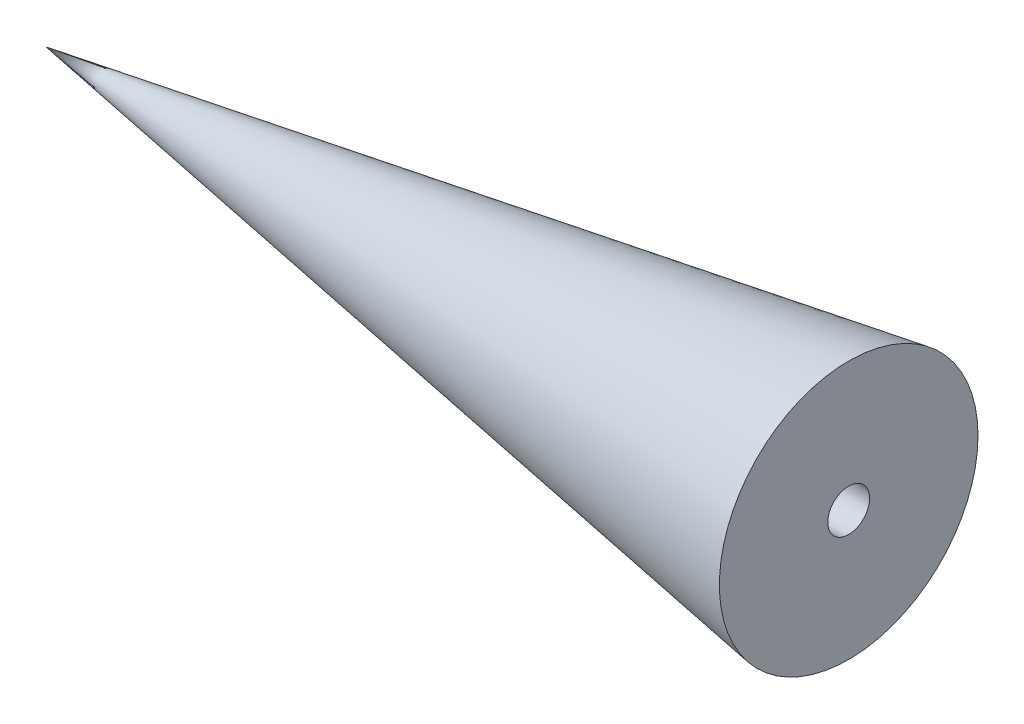
ISO-10303-21;
HEADER;
FILE_DESCRIPTION(('STEP AP214'),'2;1');
FILE_NAME('part.step','',(''),(''),'','','');
FILE_SCHEMA(('AUTOMOTIVE_DESIGN { 1 0 10303 214 1 1 1 1 }'));
ENDSEC;
DATA;
#1=APPLICATION_CONTEXT('core data for automotive mechanical design processes');
#2=APPLICATION_PROTOCOL_DEFINITION('international standard','automotive_design',2000,#1);
#3=PRODUCT_CONTEXT('',#1,'mechanical');
#4=PRODUCT('Part','Part','',(#3));
#5=PRODUCT_RELATED_PRODUCT_CATEGORY('part','',(#4));
#6=PRODUCT_DEFINITION_FORMATION('','',#4);
#7=PRODUCT_DEFINITION_CONTEXT('part definition',#1,'design');
#8=PRODUCT_DEFINITION('design','',#6,#7);
#9=PRODUCT_DEFINITION_SHAPE('','',#8);
#10=(LENGTH_UNIT() NAMED_UNIT(*) SI_UNIT(.MILLI.,.METRE.));
#11=(NAMED_UNIT(*) PLANE_ANGLE_UNIT() SI_UNIT($,.RADIAN.));
#12=(NAMED_UNIT(*) SI_UNIT($,.STERADIAN.) SOLID_ANGLE_UNIT());
#13=UNCERTAINTY_MEASURE_WITH_UNIT(LENGTH_MEASURE(1.E-05),#10,'distance_accuracy_value','');
#14=(GEOMETRIC_REPRESENTATION_CONTEXT(3) GLOBAL_UNCERTAINTY_ASSIGNED_CONTEXT((#13)) GLOBAL_UNIT_ASSIGNED_CONTEXT((#10,
#11,#12)) REPRESENTATION_CONTEXT('',''));
#15=CARTESIAN_POINT('',(0.,0.,0.));
#16=DIRECTION('',(0.,0.,1.));
#17=DIRECTION('',(1.,0.,0.));
#18=AXIS2_PLACEMENT_3D('',#15,#16,#17);
#19=CARTESIAN_POINT('',(0.,0.,0.));
#20=DIRECTION('',(1.,0.,0.));
#21=DIRECTION('',(0.,0.,-1.));
#22=AXIS2_PLACEMENT_3D('',#19,#20,#21);
#23=CONICAL_SURFACE('',#22,18.525,0.159714907105315);
#24=CARTESIAN_POINT('',(-115.,0.,0.));
#25=VERTEX_POINT('',#24);
#26=VERTEX_LOOP('',#25);
#27=FACE_BOUND('',#26,.T.);
#28=CARTESIAN_POINT('',(0.,0.,0.));
#29=DIRECTION('',(1.,0.,0.));
#30=DIRECTION('',(0.,0.,-1.));
#31=AXIS2_PLACEMENT_3D('',#28,#29,#30);
#32=CIRCLE('',#31,18.525);
#33=CARTESIAN_POINT('',(0.,0.,-18.525));
#34=VERTEX_POINT('',#33);
#35=EDGE_CURVE('E11',#34,#34,#32,.T.);
#36=ORIENTED_EDGE('',*,*,#35,.F.);
#37=EDGE_LOOP('',(#36));
#38=FACE_BOUND('',#37,.T.);
#39=ADVANCED_FACE('F40',(#27,#38),#23,.T.);
#40=CARTESIAN_POINT('',(0.,0.,0.));
#41=DIRECTION('',(1.,0.,0.));
#42=DIRECTION('',(0.,0.,-1.));
#43=AXIS2_PLACEMENT_3D('',#40,#41,#42);
#44=PLANE('',#43);
#45=CARTESIAN_POINT('',(0.,0.,0.));
#46=DIRECTION('',(1.,0.,0.));
#47=DIRECTION('',(0.,0.,-1.));
#48=AXIS2_PLACEMENT_3D('',#45,#46,#47);
#49=CIRCLE('',#48,3.);
#50=CARTESIAN_POINT('',(0.,0.,-3.));
#51=VERTEX_POINT('',#50);
#52=EDGE_CURVE('E71',#51,#51,#49,.T.);
#53=ORIENTED_EDGE('',*,*,#52,.F.);
#54=EDGE_LOOP('',(#53));
#55=FACE_BOUND('',#54,.T.);
#56=ORIENTED_EDGE('',*,*,#35,.T.);
#57=EDGE_LOOP('',(#56));
#58=FACE_BOUND('',#57,.T.);
#59=ADVANCED_FACE('F51',(#55,#58),#44,.T.);
#60=CARTESIAN_POINT('',(-50.,0.,0.));
#61=DIRECTION('',(1.,0.,0.));
#62=DIRECTION('',(0.,0.,-1.));
#63=AXIS2_PLACEMENT_3D('',#60,#61,#62);
#64=CYLINDRICAL_SURFACE('',#63,3.);
#65=CARTESIAN_POINT('',(-50.,0.,0.));
#66=DIRECTION('',(1.,0.,0.));
#67=DIRECTION('',(0.,0.,-1.));
#68=AXIS2_PLACEMENT_3D('',#65,#66,#67);
#69=CIRCLE('',#68,3.);
#70=CARTESIAN_POINT('',(-50.,0.,-3.));
#71=VERTEX_POINT('',#70);
#72=EDGE_CURVE('E46',#71,#71,#69,.T.);
#73=ORIENTED_EDGE('',*,*,#72,.F.);
#74=EDGE_LOOP('',(#73));
#75=FACE_BOUND('',#74,.T.);
#76=ORIENTED_EDGE('',*,*,#52,.T.);
#77=EDGE_LOOP('',(#76));
#78=FACE_BOUND('',#77,.T.);
#79=ADVANCED_FACE('F55',(#75,#78),#64,.F.);
#80=CARTESIAN_POINT('',(-50.,0.,0.));
#81=DIRECTION('',(1.,0.,0.));
#82=DIRECTION('',(0.,0.,-1.));
#83=AXIS2_PLACEMENT_3D('',#80,#81,#82);
#84=PLANE('',#83);
#85=ORIENTED_EDGE('',*,*,#72,.T.);
#86=EDGE_LOOP('',(#85));
#87=FACE_BOUND('',#86,.T.);
#88=ADVANCED_FACE('F60',(#87),#84,.T.);
#89=CLOSED_SHELL('',(#39,#59,#79,#88));
#90=MANIFOLD_SOLID_BREP('B2',#89);
#91=ADVANCED_BREP_SHAPE_REPRESENTATION('',(#18,#90),#14);
#92=SHAPE_DEFINITION_REPRESENTATION(#9,#91);
ENDSEC;
END-ISO-10303-21;
